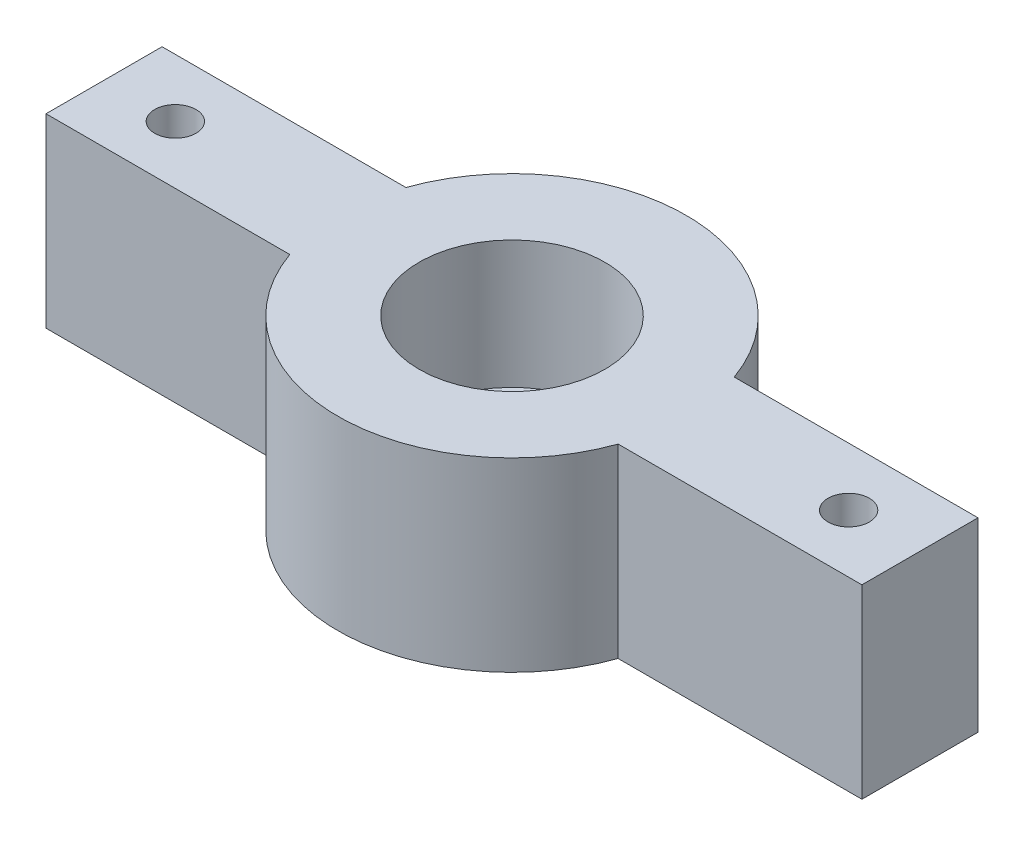
ISO-10303-21;
HEADER;
FILE_DESCRIPTION(('STEP AP214'),'2;1');
FILE_NAME('part.step','',(''),(''),'','','');
FILE_SCHEMA(('AUTOMOTIVE_DESIGN { 1 0 10303 214 1 1 1 1 }'));
ENDSEC;
DATA;
#1=APPLICATION_CONTEXT('core data for automotive mechanical design processes');
#2=APPLICATION_PROTOCOL_DEFINITION('international standard','automotive_design',2000,#1);
#3=PRODUCT_CONTEXT('',#1,'mechanical');
#4=PRODUCT('Part','Part','',(#3));
#5=PRODUCT_RELATED_PRODUCT_CATEGORY('part','',(#4));
#6=PRODUCT_DEFINITION_FORMATION('','',#4);
#7=PRODUCT_DEFINITION_CONTEXT('part definition',#1,'design');
#8=PRODUCT_DEFINITION('design','',#6,#7);
#9=PRODUCT_DEFINITION_SHAPE('','',#8);
#10=(LENGTH_UNIT() NAMED_UNIT(*) SI_UNIT(.MILLI.,.METRE.));
#11=(NAMED_UNIT(*) PLANE_ANGLE_UNIT() SI_UNIT($,.RADIAN.));
#12=(NAMED_UNIT(*) SI_UNIT($,.STERADIAN.) SOLID_ANGLE_UNIT());
#13=UNCERTAINTY_MEASURE_WITH_UNIT(LENGTH_MEASURE(1.E-05),#10,'distance_accuracy_value','');
#14=(GEOMETRIC_REPRESENTATION_CONTEXT(3) GLOBAL_UNCERTAINTY_ASSIGNED_CONTEXT((#13)) GLOBAL_UNIT_ASSIGNED_CONTEXT((#10,
#11,#12)) REPRESENTATION_CONTEXT('',''));
#15=CARTESIAN_POINT('',(0.,0.,0.));
#16=DIRECTION('',(0.,0.,1.));
#17=DIRECTION('',(1.,0.,0.));
#18=AXIS2_PLACEMENT_3D('',#15,#16,#17);
#19=CARTESIAN_POINT('',(0.,8.,0.));
#20=DIRECTION('',(0.,-1.,0.));
#21=DIRECTION('',(0.,0.,-1.));
#22=AXIS2_PLACEMENT_3D('',#19,#20,#21);
#23=CYLINDRICAL_SURFACE('',#22,1.875);
#24=CARTESIAN_POINT('',(0.,0.,0.));
#25=DIRECTION('',(0.,1.,0.));
#26=DIRECTION('',(0.,0.,1.));
#27=AXIS2_PLACEMENT_3D('',#24,#25,#26);
#28=CIRCLE('',#27,1.875);
#29=CARTESIAN_POINT('',(0.,0.,1.875));
#30=VERTEX_POINT('',#29);
#31=EDGE_CURVE('E136',#30,#30,#28,.T.);
#32=ORIENTED_EDGE('',*,*,#31,.F.);
#33=EDGE_LOOP('',(#32));
#34=FACE_BOUND('',#33,.T.);
#35=CARTESIAN_POINT('',(0.,2.5,0.));
#36=DIRECTION('',(0.,1.,0.));
#37=DIRECTION('',(0.,0.,1.));
#38=AXIS2_PLACEMENT_3D('',#35,#36,#37);
#39=CIRCLE('',#38,1.875);
#40=CARTESIAN_POINT('',(0.,2.5,1.875));
#41=VERTEX_POINT('',#40);
#42=EDGE_CURVE('E37',#41,#41,#39,.T.);
#43=ORIENTED_EDGE('',*,*,#42,.T.);
#44=EDGE_LOOP('',(#43));
#45=FACE_BOUND('',#44,.T.);
#46=ADVANCED_FACE('F33',(#34,#45),#23,.F.);
#47=CARTESIAN_POINT('',(0.,8.,0.));
#48=DIRECTION('',(0.,1.,0.));
#49=DIRECTION('',(0.,0.,1.));
#50=AXIS2_PLACEMENT_3D('',#47,#48,#49);
#51=PLANE('',#50);
#52=CARTESIAN_POINT('',(0.,8.,0.));
#53=DIRECTION('',(0.,1.,0.));
#54=DIRECTION('',(0.,0.,1.));
#55=AXIS2_PLACEMENT_3D('',#52,#53,#54);
#56=CIRCLE('',#55,4.);
#57=CARTESIAN_POINT('',(0.,8.,4.));
#58=VERTEX_POINT('',#57);
#59=EDGE_CURVE('E196',#58,#58,#56,.T.);
#60=ORIENTED_EDGE('',*,*,#59,.F.);
#61=EDGE_LOOP('',(#60));
#62=FACE_BOUND('',#61,.T.);
#63=CARTESIAN_POINT('',(-14.5,8.,0.));
#64=DIRECTION('',(0.,1.,0.));
#65=DIRECTION('',(0.,0.,1.));
#66=AXIS2_PLACEMENT_3D('',#63,#64,#65);
#67=CIRCLE('',#66,0.889000000000002);
#68=CARTESIAN_POINT('',(-14.5,8.,0.889000000000002));
#69=VERTEX_POINT('',#68);
#70=EDGE_CURVE('E184',#69,#69,#67,.T.);
#71=ORIENTED_EDGE('',*,*,#70,.F.);
#72=EDGE_LOOP('',(#71));
#73=FACE_BOUND('',#72,.T.);
#74=CARTESIAN_POINT('',(0.,8.,0.));
#75=DIRECTION('',(0.,1.,0.));
#76=DIRECTION('',(0.,0.,1.));
#77=AXIS2_PLACEMENT_3D('',#74,#75,#76);
#78=CIRCLE('',#77,7.5);
#79=CARTESIAN_POINT('',(-7.07106781186548,8.,2.5));
#80=VERTEX_POINT('',#79);
#81=CARTESIAN_POINT('',(7.07106781186548,8.,2.5));
#82=VERTEX_POINT('',#81);
#83=EDGE_CURVE('E147',#80,#82,#78,.T.);
#84=ORIENTED_EDGE('',*,*,#83,.T.);
#85=DIRECTION('',(1.,0.,0.));
#86=VECTOR('',#85,1.);
#87=CARTESIAN_POINT('',(17.5710678118655,8.,2.5));
#88=LINE('',#87,#86);
#89=CARTESIAN_POINT('',(17.5710678118655,8.,2.5));
#90=VERTEX_POINT('',#89);
#91=EDGE_CURVE('E94',#82,#90,#88,.T.);
#92=ORIENTED_EDGE('',*,*,#91,.T.);
#93=DIRECTION('',(0.,0.,-1.));
#94=VECTOR('',#93,1.);
#95=CARTESIAN_POINT('',(17.5710678118655,8.,-2.5));
#96=LINE('',#95,#94);
#97=CARTESIAN_POINT('',(17.5710678118655,8.,-2.5));
#98=VERTEX_POINT('',#97);
#99=EDGE_CURVE('E163',#90,#98,#96,.T.);
#100=ORIENTED_EDGE('',*,*,#99,.T.);
#101=DIRECTION('',(-1.,0.,0.));
#102=VECTOR('',#101,1.);
#103=CARTESIAN_POINT('',(7.07106781186548,8.,-2.5));
#104=LINE('',#103,#102);
#105=CARTESIAN_POINT('',(7.07106781186548,8.,-2.5));
#106=VERTEX_POINT('',#105);
#107=EDGE_CURVE('E176',#98,#106,#104,.T.);
#108=ORIENTED_EDGE('',*,*,#107,.T.);
#109=CARTESIAN_POINT('',(0.,8.,0.));
#110=DIRECTION('',(0.,1.,0.));
#111=DIRECTION('',(0.,0.,1.));
#112=AXIS2_PLACEMENT_3D('',#109,#110,#111);
#113=CIRCLE('',#112,7.5);
#114=CARTESIAN_POINT('',(-7.07106781186548,8.,-2.5));
#115=VERTEX_POINT('',#114);
#116=EDGE_CURVE('E114',#106,#115,#113,.T.);
#117=ORIENTED_EDGE('',*,*,#116,.T.);
#118=DIRECTION('',(-1.,0.,0.));
#119=VECTOR('',#118,1.);
#120=CARTESIAN_POINT('',(-7.07106781186548,8.,-2.5));
#121=LINE('',#120,#119);
#122=CARTESIAN_POINT('',(-17.5710678118655,8.,-2.5));
#123=VERTEX_POINT('',#122);
#124=EDGE_CURVE('E107',#115,#123,#121,.T.);
#125=ORIENTED_EDGE('',*,*,#124,.T.);
#126=DIRECTION('',(0.,0.,1.));
#127=VECTOR('',#126,1.);
#128=CARTESIAN_POINT('',(-17.5710678118655,8.,-2.5));
#129=LINE('',#128,#127);
#130=CARTESIAN_POINT('',(-17.5710678118655,8.,2.5));
#131=VERTEX_POINT('',#130);
#132=EDGE_CURVE('E112',#123,#131,#129,.T.);
#133=ORIENTED_EDGE('',*,*,#132,.T.);
#134=DIRECTION('',(1.,0.,0.));
#135=VECTOR('',#134,1.);
#136=CARTESIAN_POINT('',(-17.5710678118655,8.,2.5));
#137=LINE('',#136,#135);
#138=EDGE_CURVE('E51',#131,#80,#137,.T.);
#139=ORIENTED_EDGE('',*,*,#138,.T.);
#140=EDGE_LOOP('',(#84,#92,#100,#108,#117,#125,#133,#139));
#141=FACE_BOUND('',#140,.T.);
#142=CARTESIAN_POINT('',(14.5,8.,0.));
#143=DIRECTION('',(0.,1.,0.));
#144=DIRECTION('',(0.,0.,1.));
#145=AXIS2_PLACEMENT_3D('',#142,#143,#144);
#146=CIRCLE('',#145,0.889000000000002);
#147=CARTESIAN_POINT('',(14.5,8.,0.889000000000002));
#148=VERTEX_POINT('',#147);
#149=EDGE_CURVE('E188',#148,#148,#146,.T.);
#150=ORIENTED_EDGE('',*,*,#149,.F.);
#151=EDGE_LOOP('',(#150));
#152=FACE_BOUND('',#151,.T.);
#153=ADVANCED_FACE('F109',(#62,#73,#141,#152),#51,.T.);
#154=CARTESIAN_POINT('',(0.,0.,0.));
#155=DIRECTION('',(0.,1.,0.));
#156=DIRECTION('',(0.,0.,1.));
#157=AXIS2_PLACEMENT_3D('',#154,#155,#156);
#158=PLANE('',#157);
#159=CARTESIAN_POINT('',(-14.5,0.,0.));
#160=DIRECTION('',(0.,1.,0.));
#161=DIRECTION('',(0.,0.,1.));
#162=AXIS2_PLACEMENT_3D('',#159,#160,#161);
#163=CIRCLE('',#162,0.889000000000002);
#164=CARTESIAN_POINT('',(-14.5,0.,0.889000000000002));
#165=VERTEX_POINT('',#164);
#166=EDGE_CURVE('E185',#165,#165,#163,.T.);
#167=ORIENTED_EDGE('',*,*,#166,.T.);
#168=EDGE_LOOP('',(#167));
#169=FACE_BOUND('',#168,.T.);
#170=CARTESIAN_POINT('',(0.,0.,0.));
#171=DIRECTION('',(0.,1.,0.));
#172=DIRECTION('',(0.,0.,1.));
#173=AXIS2_PLACEMENT_3D('',#170,#171,#172);
#174=CIRCLE('',#173,7.5);
#175=CARTESIAN_POINT('',(-7.07106781186548,0.,2.5));
#176=VERTEX_POINT('',#175);
#177=CARTESIAN_POINT('',(7.07106781186548,0.,2.5));
#178=VERTEX_POINT('',#177);
#179=EDGE_CURVE('E132',#176,#178,#174,.T.);
#180=ORIENTED_EDGE('',*,*,#179,.F.);
#181=DIRECTION('',(1.,0.,0.));
#182=VECTOR('',#181,1.);
#183=CARTESIAN_POINT('',(-17.5710678118655,0.,2.5));
#184=LINE('',#183,#182);
#185=CARTESIAN_POINT('',(-17.5710678118655,0.,2.5));
#186=VERTEX_POINT('',#185);
#187=EDGE_CURVE('E86',#186,#176,#184,.T.);
#188=ORIENTED_EDGE('',*,*,#187,.F.);
#189=DIRECTION('',(0.,0.,1.));
#190=VECTOR('',#189,1.);
#191=CARTESIAN_POINT('',(-17.5710678118655,0.,-2.5));
#192=LINE('',#191,#190);
#193=CARTESIAN_POINT('',(-17.5710678118655,0.,-2.5));
#194=VERTEX_POINT('',#193);
#195=EDGE_CURVE('E80',#194,#186,#192,.T.);
#196=ORIENTED_EDGE('',*,*,#195,.F.);
#197=DIRECTION('',(-1.,0.,0.));
#198=VECTOR('',#197,1.);
#199=CARTESIAN_POINT('',(-7.07106781186548,0.,-2.5));
#200=LINE('',#199,#198);
#201=CARTESIAN_POINT('',(-7.07106781186548,0.,-2.5));
#202=VERTEX_POINT('',#201);
#203=EDGE_CURVE('E122',#202,#194,#200,.T.);
#204=ORIENTED_EDGE('',*,*,#203,.F.);
#205=CARTESIAN_POINT('',(0.,0.,0.));
#206=DIRECTION('',(0.,1.,0.));
#207=DIRECTION('',(0.,0.,1.));
#208=AXIS2_PLACEMENT_3D('',#205,#206,#207);
#209=CIRCLE('',#208,7.5);
#210=CARTESIAN_POINT('',(7.07106781186548,0.,-2.5));
#211=VERTEX_POINT('',#210);
#212=EDGE_CURVE('E142',#211,#202,#209,.T.);
#213=ORIENTED_EDGE('',*,*,#212,.F.);
#214=DIRECTION('',(-1.,0.,0.));
#215=VECTOR('',#214,1.);
#216=CARTESIAN_POINT('',(7.07106781186548,0.,-2.5));
#217=LINE('',#216,#215);
#218=CARTESIAN_POINT('',(17.5710678118655,0.,-2.5));
#219=VERTEX_POINT('',#218);
#220=EDGE_CURVE('E140',#219,#211,#217,.T.);
#221=ORIENTED_EDGE('',*,*,#220,.F.);
#222=DIRECTION('',(0.,0.,-1.));
#223=VECTOR('',#222,1.);
#224=CARTESIAN_POINT('',(17.5710678118655,0.,-2.5));
#225=LINE('',#224,#223);
#226=CARTESIAN_POINT('',(17.5710678118655,0.,2.5));
#227=VERTEX_POINT('',#226);
#228=EDGE_CURVE('E138',#227,#219,#225,.T.);
#229=ORIENTED_EDGE('',*,*,#228,.F.);
#230=DIRECTION('',(1.,0.,0.));
#231=VECTOR('',#230,1.);
#232=CARTESIAN_POINT('',(17.5710678118655,0.,2.5));
#233=LINE('',#232,#231);
#234=EDGE_CURVE('E135',#178,#227,#233,.T.);
#235=ORIENTED_EDGE('',*,*,#234,.F.);
#236=EDGE_LOOP('',(#180,#188,#196,#204,#213,#221,#229,#235));
#237=FACE_BOUND('',#236,.T.);
#238=ORIENTED_EDGE('',*,*,#31,.T.);
#239=EDGE_LOOP('',(#238));
#240=FACE_BOUND('',#239,.T.);
#241=CARTESIAN_POINT('',(14.5,0.,0.));
#242=DIRECTION('',(0.,1.,0.));
#243=DIRECTION('',(0.,0.,1.));
#244=AXIS2_PLACEMENT_3D('',#241,#242,#243);
#245=CIRCLE('',#244,0.889000000000002);
#246=CARTESIAN_POINT('',(14.5,0.,0.889000000000002));
#247=VERTEX_POINT('',#246);
#248=EDGE_CURVE('E191',#247,#247,#245,.T.);
#249=ORIENTED_EDGE('',*,*,#248,.T.);
#250=EDGE_LOOP('',(#249));
#251=FACE_BOUND('',#250,.T.);
#252=ADVANCED_FACE('F167',(#169,#237,#240,#251),#158,.F.);
#253=CARTESIAN_POINT('',(0.,8.,0.));
#254=DIRECTION('',(0.,-1.,0.));
#255=DIRECTION('',(0.,0.,-1.));
#256=AXIS2_PLACEMENT_3D('',#253,#254,#255);
#257=CYLINDRICAL_SURFACE('',#256,7.5);
#258=ORIENTED_EDGE('',*,*,#179,.T.);
#259=DIRECTION('',(0.,-1.,0.));
#260=VECTOR('',#259,1.);
#261=CARTESIAN_POINT('',(7.07106781186548,8.,2.5));
#262=LINE('',#261,#260);
#263=EDGE_CURVE('E11',#82,#178,#262,.T.);
#264=ORIENTED_EDGE('',*,*,#263,.F.);
#265=ORIENTED_EDGE('',*,*,#83,.F.);
#266=DIRECTION('',(0.,-1.,0.));
#267=VECTOR('',#266,1.);
#268=CARTESIAN_POINT('',(-7.07106781186548,8.,2.5));
#269=LINE('',#268,#267);
#270=EDGE_CURVE('E128',#80,#176,#269,.T.);
#271=ORIENTED_EDGE('',*,*,#270,.T.);
#272=EDGE_LOOP('',(#258,#264,#265,#271));
#273=FACE_BOUND('',#272,.T.);
#274=ADVANCED_FACE('F35',(#273),#257,.T.);
#275=CARTESIAN_POINT('',(17.5710678118655,8.,2.5));
#276=DIRECTION('',(0.,0.,-1.));
#277=DIRECTION('',(-1.,0.,0.));
#278=AXIS2_PLACEMENT_3D('',#275,#276,#277);
#279=PLANE('',#278);
#280=ORIENTED_EDGE('',*,*,#234,.T.);
#281=DIRECTION('',(0.,-1.,0.));
#282=VECTOR('',#281,1.);
#283=CARTESIAN_POINT('',(17.5710678118655,8.,2.5));
#284=LINE('',#283,#282);
#285=EDGE_CURVE('E43',#90,#227,#284,.T.);
#286=ORIENTED_EDGE('',*,*,#285,.F.);
#287=ORIENTED_EDGE('',*,*,#91,.F.);
#288=ORIENTED_EDGE('',*,*,#263,.T.);
#289=EDGE_LOOP('',(#280,#286,#287,#288));
#290=FACE_BOUND('',#289,.T.);
#291=ADVANCED_FACE('F245',(#290),#279,.F.);
#292=CARTESIAN_POINT('',(17.5710678118655,8.,-2.5));
#293=DIRECTION('',(-1.,0.,0.));
#294=DIRECTION('',(0.,0.,1.));
#295=AXIS2_PLACEMENT_3D('',#292,#293,#294);
#296=PLANE('',#295);
#297=ORIENTED_EDGE('',*,*,#228,.T.);
#298=DIRECTION('',(0.,-1.,0.));
#299=VECTOR('',#298,1.);
#300=CARTESIAN_POINT('',(17.5710678118655,8.,-2.5));
#301=LINE('',#300,#299);
#302=EDGE_CURVE('E154',#98,#219,#301,.T.);
#303=ORIENTED_EDGE('',*,*,#302,.F.);
#304=ORIENTED_EDGE('',*,*,#99,.F.);
#305=ORIENTED_EDGE('',*,*,#285,.T.);
#306=EDGE_LOOP('',(#297,#303,#304,#305));
#307=FACE_BOUND('',#306,.T.);
#308=ADVANCED_FACE('F161',(#307),#296,.F.);
#309=CARTESIAN_POINT('',(7.07106781186548,8.,-2.5));
#310=DIRECTION('',(0.,0.,1.));
#311=DIRECTION('',(1.,0.,0.));
#312=AXIS2_PLACEMENT_3D('',#309,#310,#311);
#313=PLANE('',#312);
#314=ORIENTED_EDGE('',*,*,#220,.T.);
#315=DIRECTION('',(0.,-1.,0.));
#316=VECTOR('',#315,1.);
#317=CARTESIAN_POINT('',(7.07106781186548,8.,-2.5));
#318=LINE('',#317,#316);
#319=EDGE_CURVE('E151',#106,#211,#318,.T.);
#320=ORIENTED_EDGE('',*,*,#319,.F.);
#321=ORIENTED_EDGE('',*,*,#107,.F.);
#322=ORIENTED_EDGE('',*,*,#302,.T.);
#323=EDGE_LOOP('',(#314,#320,#321,#322));
#324=FACE_BOUND('',#323,.T.);
#325=ADVANCED_FACE('F172',(#324),#313,.F.);
#326=CARTESIAN_POINT('',(0.,8.,0.));
#327=DIRECTION('',(0.,-1.,0.));
#328=DIRECTION('',(0.,0.,-1.));
#329=AXIS2_PLACEMENT_3D('',#326,#327,#328);
#330=CYLINDRICAL_SURFACE('',#329,7.5);
#331=ORIENTED_EDGE('',*,*,#212,.T.);
#332=DIRECTION('',(0.,-1.,0.));
#333=VECTOR('',#332,1.);
#334=CARTESIAN_POINT('',(-7.07106781186548,8.,-2.5));
#335=LINE('',#334,#333);
#336=EDGE_CURVE('E123',#115,#202,#335,.T.);
#337=ORIENTED_EDGE('',*,*,#336,.F.);
#338=ORIENTED_EDGE('',*,*,#116,.F.);
#339=ORIENTED_EDGE('',*,*,#319,.T.);
#340=EDGE_LOOP('',(#331,#337,#338,#339));
#341=FACE_BOUND('',#340,.T.);
#342=ADVANCED_FACE('F175',(#341),#330,.T.);
#343=CARTESIAN_POINT('',(-7.07106781186548,8.,-2.5));
#344=DIRECTION('',(0.,0.,1.));
#345=DIRECTION('',(1.,0.,0.));
#346=AXIS2_PLACEMENT_3D('',#343,#344,#345);
#347=PLANE('',#346);
#348=ORIENTED_EDGE('',*,*,#203,.T.);
#349=DIRECTION('',(0.,-1.,0.));
#350=VECTOR('',#349,1.);
#351=CARTESIAN_POINT('',(-17.5710678118655,8.,-2.5));
#352=LINE('',#351,#350);
#353=EDGE_CURVE('E119',#123,#194,#352,.T.);
#354=ORIENTED_EDGE('',*,*,#353,.F.);
#355=ORIENTED_EDGE('',*,*,#124,.F.);
#356=ORIENTED_EDGE('',*,*,#336,.T.);
#357=EDGE_LOOP('',(#348,#354,#355,#356));
#358=FACE_BOUND('',#357,.T.);
#359=ADVANCED_FACE('F120',(#358),#347,.F.);
#360=CARTESIAN_POINT('',(-17.5710678118655,8.,-2.5));
#361=DIRECTION('',(1.,0.,0.));
#362=DIRECTION('',(0.,0.,-1.));
#363=AXIS2_PLACEMENT_3D('',#360,#361,#362);
#364=PLANE('',#363);
#365=ORIENTED_EDGE('',*,*,#195,.T.);
#366=DIRECTION('',(0.,-1.,0.));
#367=VECTOR('',#366,1.);
#368=CARTESIAN_POINT('',(-17.5710678118655,8.,2.5));
#369=LINE('',#368,#367);
#370=EDGE_CURVE('E124',#131,#186,#369,.T.);
#371=ORIENTED_EDGE('',*,*,#370,.F.);
#372=ORIENTED_EDGE('',*,*,#132,.F.);
#373=ORIENTED_EDGE('',*,*,#353,.T.);
#374=EDGE_LOOP('',(#365,#371,#372,#373));
#375=FACE_BOUND('',#374,.T.);
#376=ADVANCED_FACE('F126',(#375),#364,.F.);
#377=CARTESIAN_POINT('',(-17.5710678118655,8.,2.5));
#378=DIRECTION('',(0.,0.,-1.));
#379=DIRECTION('',(-1.,0.,0.));
#380=AXIS2_PLACEMENT_3D('',#377,#378,#379);
#381=PLANE('',#380);
#382=ORIENTED_EDGE('',*,*,#187,.T.);
#383=ORIENTED_EDGE('',*,*,#270,.F.);
#384=ORIENTED_EDGE('',*,*,#138,.F.);
#385=ORIENTED_EDGE('',*,*,#370,.T.);
#386=EDGE_LOOP('',(#382,#383,#384,#385));
#387=FACE_BOUND('',#386,.T.);
#388=ADVANCED_FACE('F233',(#387),#381,.F.);
#389=CARTESIAN_POINT('',(-14.5,8.,0.));
#390=DIRECTION('',(0.,-1.,0.));
#391=DIRECTION('',(0.,0.,-1.));
#392=AXIS2_PLACEMENT_3D('',#389,#390,#391);
#393=CYLINDRICAL_SURFACE('',#392,0.889000000000002);
#394=ORIENTED_EDGE('',*,*,#70,.T.);
#395=EDGE_LOOP('',(#394));
#396=FACE_BOUND('',#395,.T.);
#397=ORIENTED_EDGE('',*,*,#166,.F.);
#398=EDGE_LOOP('',(#397));
#399=FACE_BOUND('',#398,.T.);
#400=ADVANCED_FACE('F227',(#396,#399),#393,.F.);
#401=CARTESIAN_POINT('',(14.5,8.,0.));
#402=DIRECTION('',(0.,-1.,0.));
#403=DIRECTION('',(0.,0.,-1.));
#404=AXIS2_PLACEMENT_3D('',#401,#402,#403);
#405=CYLINDRICAL_SURFACE('',#404,0.889000000000002);
#406=ORIENTED_EDGE('',*,*,#149,.T.);
#407=EDGE_LOOP('',(#406));
#408=FACE_BOUND('',#407,.T.);
#409=ORIENTED_EDGE('',*,*,#248,.F.);
#410=EDGE_LOOP('',(#409));
#411=FACE_BOUND('',#410,.T.);
#412=ADVANCED_FACE('F214',(#408,#411),#405,.F.);
#413=CARTESIAN_POINT('',(0.,2.5,0.));
#414=DIRECTION('',(0.,1.,0.));
#415=DIRECTION('',(0.,0.,1.));
#416=AXIS2_PLACEMENT_3D('',#413,#414,#415);
#417=CYLINDRICAL_SURFACE('',#416,4.);
#418=CARTESIAN_POINT('',(0.,2.5,0.));
#419=DIRECTION('',(0.,1.,0.));
#420=DIRECTION('',(0.,0.,1.));
#421=AXIS2_PLACEMENT_3D('',#418,#419,#420);
#422=CIRCLE('',#421,4.);
#423=CARTESIAN_POINT('',(0.,2.5,4.));
#424=VERTEX_POINT('',#423);
#425=EDGE_CURVE('E199',#424,#424,#422,.T.);
#426=ORIENTED_EDGE('',*,*,#425,.F.);
#427=EDGE_LOOP('',(#426));
#428=FACE_BOUND('',#427,.T.);
#429=ORIENTED_EDGE('',*,*,#59,.T.);
#430=EDGE_LOOP('',(#429));
#431=FACE_BOUND('',#430,.T.);
#432=ADVANCED_FACE('F209',(#428,#431),#417,.F.);
#433=CARTESIAN_POINT('',(0.,2.5,0.));
#434=DIRECTION('',(0.,1.,0.));
#435=DIRECTION('',(0.,0.,1.));
#436=AXIS2_PLACEMENT_3D('',#433,#434,#435);
#437=PLANE('',#436);
#438=ORIENTED_EDGE('',*,*,#42,.F.);
#439=EDGE_LOOP('',(#438));
#440=FACE_BOUND('',#439,.T.);
#441=ORIENTED_EDGE('',*,*,#425,.T.);
#442=EDGE_LOOP('',(#441));
#443=FACE_BOUND('',#442,.T.);
#444=ADVANCED_FACE('F207',(#440,#443),#437,.T.);
#445=CLOSED_SHELL('',(#46,#153,#252,#274,#291,#308,#325,#342,#359,#376,#388,#400,#412,#432,#444));
#446=MANIFOLD_SOLID_BREP('B2',#445);
#447=ADVANCED_BREP_SHAPE_REPRESENTATION('',(#18,#446),#14);
#448=SHAPE_DEFINITION_REPRESENTATION(#9,#447);
ENDSEC;
END-ISO-10303-21;
